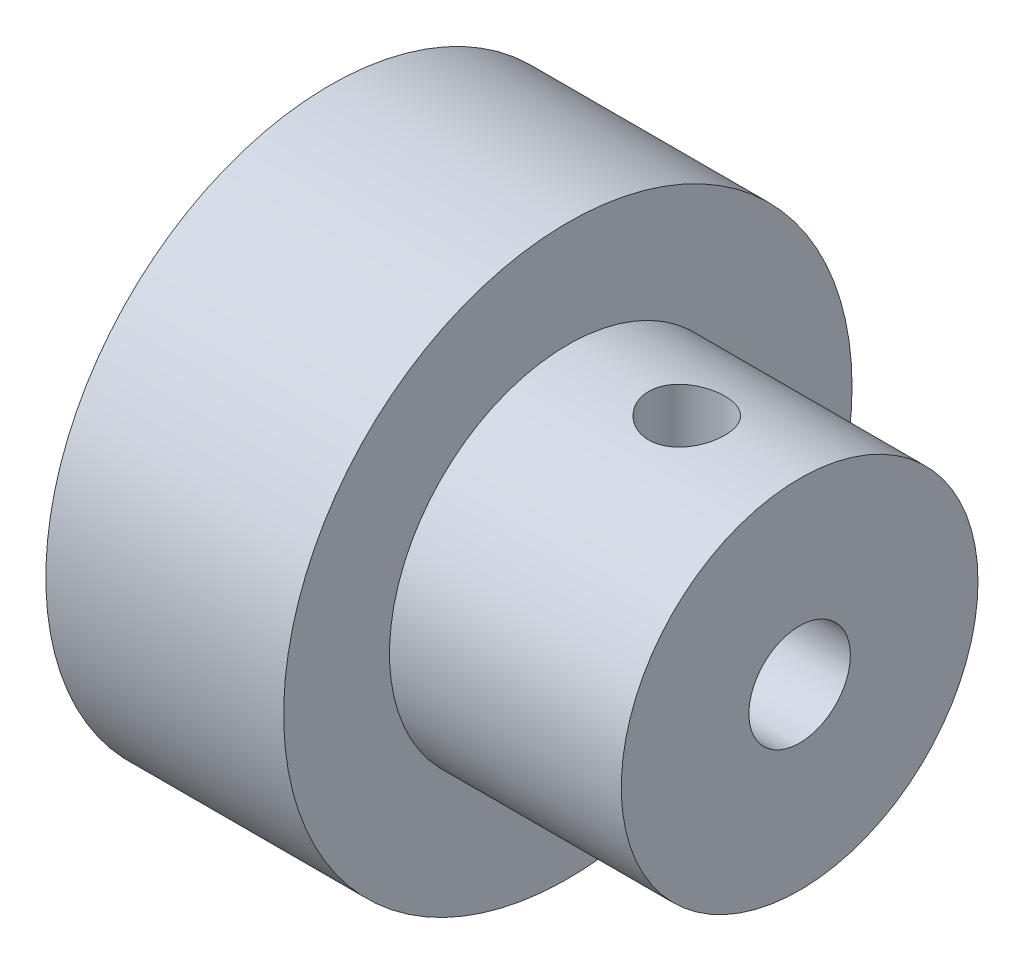
ISO-10303-21;
HEADER;
FILE_DESCRIPTION(('STEP AP214'),'2;1');
FILE_NAME('part.step','',(''),(''),'','','');
FILE_SCHEMA(('AUTOMOTIVE_DESIGN { 1 0 10303 214 1 1 1 1 }'));
ENDSEC;
DATA;
#1=APPLICATION_CONTEXT('core data for automotive mechanical design processes');
#2=APPLICATION_PROTOCOL_DEFINITION('international standard','automotive_design',2000,#1);
#3=PRODUCT_CONTEXT('',#1,'mechanical');
#4=PRODUCT('Part','Part','',(#3));
#5=PRODUCT_RELATED_PRODUCT_CATEGORY('part','',(#4));
#6=PRODUCT_DEFINITION_FORMATION('','',#4);
#7=PRODUCT_DEFINITION_CONTEXT('part definition',#1,'design');
#8=PRODUCT_DEFINITION('design','',#6,#7);
#9=PRODUCT_DEFINITION_SHAPE('','',#8);
#10=(LENGTH_UNIT() NAMED_UNIT(*) SI_UNIT(.MILLI.,.METRE.));
#11=(NAMED_UNIT(*) PLANE_ANGLE_UNIT() SI_UNIT($,.RADIAN.));
#12=(NAMED_UNIT(*) SI_UNIT($,.STERADIAN.) SOLID_ANGLE_UNIT());
#13=UNCERTAINTY_MEASURE_WITH_UNIT(LENGTH_MEASURE(1.E-05),#10,'distance_accuracy_value','');
#14=(GEOMETRIC_REPRESENTATION_CONTEXT(3) GLOBAL_UNCERTAINTY_ASSIGNED_CONTEXT((#13)) GLOBAL_UNIT_ASSIGNED_CONTEXT((#10,
#11,#12)) REPRESENTATION_CONTEXT('',''));
#15=CARTESIAN_POINT('',(0.,0.,0.));
#16=DIRECTION('',(0.,0.,1.));
#17=DIRECTION('',(1.,0.,0.));
#18=AXIS2_PLACEMENT_3D('',#15,#16,#17);
#19=CARTESIAN_POINT('',(-14.6892880689265,0.,0.));
#20=DIRECTION('',(1.,0.,0.));
#21=DIRECTION('',(0.,0.,-1.));
#22=AXIS2_PLACEMENT_3D('',#19,#20,#21);
#23=PLANE('',#22);
#24=CARTESIAN_POINT('',(-14.6892880689265,0.,0.));
#25=DIRECTION('',(1.,0.,0.));
#26=DIRECTION('',(0.,0.,-1.));
#27=AXIS2_PLACEMENT_3D('',#24,#25,#26);
#28=CIRCLE('',#27,8.89);
#29=CARTESIAN_POINT('',(-14.6892880689265,0.,-8.89));
#30=VERTEX_POINT('',#29);
#31=EDGE_CURVE('E122',#30,#30,#28,.T.);
#32=ORIENTED_EDGE('',*,*,#31,.F.);
#33=EDGE_LOOP('',(#32));
#34=FACE_BOUND('',#33,.T.);
#35=CARTESIAN_POINT('',(-14.6892880689265,0.,0.));
#36=DIRECTION('',(1.,0.,0.));
#37=DIRECTION('',(0.,0.,-1.));
#38=AXIS2_PLACEMENT_3D('',#35,#36,#37);
#39=CIRCLE('',#38,1.5875);
#40=CARTESIAN_POINT('',(-14.6892880689265,0.,-1.5875));
#41=VERTEX_POINT('',#40);
#42=EDGE_CURVE('E10',#41,#41,#39,.T.);
#43=ORIENTED_EDGE('',*,*,#42,.T.);
#44=EDGE_LOOP('',(#43));
#45=FACE_BOUND('',#44,.T.);
#46=ADVANCED_FACE('F45',(#34,#45),#23,.F.);
#47=CARTESIAN_POINT('',(0.,0.,0.));
#48=DIRECTION('',(1.,0.,0.));
#49=DIRECTION('',(0.,0.,-1.));
#50=AXIS2_PLACEMENT_3D('',#47,#48,#49);
#51=CYLINDRICAL_SURFACE('',#50,1.5875);
#52=CARTESIAN_POINT('',(-3.52955632665525,-1.05003255157876,1.190625));
#53=CARTESIAN_POINT('',(-3.47399587181116,-1.050045445975,1.19061880120499));
#54=CARTESIAN_POINT('',(-3.41839494567017,-1.05454741000987,1.18668886577821));
#55=CARTESIAN_POINT('',(-3.30942575328898,-1.07148823701036,1.17140301985762));
#56=CARTESIAN_POINT('',(-3.25606464842102,-1.08395075602632,1.16002497361435));
#57=CARTESIAN_POINT('',(-3.15365232330667,-1.11422757784016,1.13096547199778));
#58=CARTESIAN_POINT('',(-3.10455179760005,-1.13196567044321,1.11337314984434));
#59=CARTESIAN_POINT('',(-3.01016962218938,-1.17067373681068,1.0725995764387));
#60=CARTESIAN_POINT('',(-2.96488751182031,-1.19164331985289,1.04941900067592));
#61=CARTESIAN_POINT('',(-2.86906679457896,-1.2396574216291,0.992504284125244));
#62=CARTESIAN_POINT('',(-2.81941365386299,-1.26705442557768,0.957576618231006));
#63=CARTESIAN_POINT('',(-2.72586423782545,-1.321761740015,0.880535424277007));
#64=CARTESIAN_POINT('',(-2.68197661082916,-1.34907186163527,0.83841131436972));
#65=CARTESIAN_POINT('',(-2.59224970284748,-1.40702174808774,0.737878090100433));
#66=CARTESIAN_POINT('',(-2.54784159057137,-1.43720281226121,0.677900035756593));
#67=CARTESIAN_POINT('',(-2.47019994883075,-1.49131980240358,0.548631836139916));
#68=CARTESIAN_POINT('',(-2.43694016553939,-1.51527037067959,0.479364114482458));
#69=CARTESIAN_POINT('',(-2.39194772596979,-1.54808443073509,0.355496037787019));
#70=CARTESIAN_POINT('',(-2.37674788172235,-1.55931958043549,0.302772801943451));
#71=CARTESIAN_POINT('',(-2.35370292208284,-1.57643223525434,0.194907383645006));
#72=CARTESIAN_POINT('',(-2.34585141687053,-1.58231439499439,0.139767346508667));
#73=CARTESIAN_POINT('',(-2.3379615754019,-1.58822529365106,0.0284679172687354));
#74=CARTESIAN_POINT('',(-2.33794354099396,-1.58823882295637,-0.0276937463004187));
#75=CARTESIAN_POINT('',(-2.34577181397461,-1.58237401411808,-0.139157199360015));
#76=CARTESIAN_POINT('',(-2.35361994258859,-1.57649431153499,-0.194458786708892));
#77=CARTESIAN_POINT('',(-2.37630191056096,-1.55965031243376,-0.300743297572916));
#78=CARTESIAN_POINT('',(-2.390887285725,-1.54886705851508,-0.351809262912558));
#79=CARTESIAN_POINT('',(-2.4262403676374,-1.52306558684007,-0.450596385005576));
#80=CARTESIAN_POINT('',(-2.44700942243758,-1.50804644569141,-0.498316809620447));
#81=CARTESIAN_POINT('',(-2.49651420867685,-1.472890802502,-0.594690931730129));
#82=CARTESIAN_POINT('',(-2.52586905334639,-1.45237629107677,-0.642886211616418));
#83=CARTESIAN_POINT('',(-2.59033870418185,-1.40859432596468,-0.733875255122699));
#84=CARTESIAN_POINT('',(-2.62545841877955,-1.38532453106985,-0.776664360293093));
#85=CARTESIAN_POINT('',(-2.70820235978188,-1.33265676661185,-0.864458871498921));
#86=CARTESIAN_POINT('',(-2.75692738711371,-1.30295376843929,-0.908244413225473));
#87=CARTESIAN_POINT('',(-2.86108752740517,-1.24401229387742,-0.987431949727556));
#88=CARTESIAN_POINT('',(-2.91652581815327,-1.21477404494797,-1.0228299505536));
#89=CARTESIAN_POINT('',(-3.02233568616272,-1.16537919386833,-1.07849357589208));
#90=CARTESIAN_POINT('',(-3.07155229386264,-1.14456844833299,-1.10036663076556));
#91=CARTESIAN_POINT('',(-3.17400814378189,-1.10757288373056,-1.13759771455097));
#92=CARTESIAN_POINT('',(-3.22723796990948,-1.09137763785656,-1.15297046685305));
#93=CARTESIAN_POINT('',(-3.32610783845392,-1.06870540179809,-1.17397518372094));
#94=CARTESIAN_POINT('',(-3.37116119808551,-1.06093847023265,-1.18093386412912));
#95=CARTESIAN_POINT('',(-3.46236972793073,-1.05120748322927,-1.18960709991958));
#96=CARTESIAN_POINT('',(-3.50852341207812,-1.04923600365031,-1.19132836468154));
#97=CARTESIAN_POINT('',(-3.60058027634364,-1.05142402102457,-1.18939683154219));
#98=CARTESIAN_POINT('',(-3.64648335801668,-1.05558577464436,-1.1857420555772));
#99=CARTESIAN_POINT('',(-3.73678552265678,-1.06934967402693,-1.17334131022126));
#100=CARTESIAN_POINT('',(-3.78118190127656,-1.0789611050858,-1.16458665082263));
#101=CARTESIAN_POINT('',(-3.88383714982548,-1.10670783140942,-1.13834830402645));
#102=CARTESIAN_POINT('',(-3.94106486507531,-1.12668703809744,-1.11882388129336));
#103=CARTESIAN_POINT('',(-4.05050053466959,-1.1710817723223,-1.07226796784258));
#104=CARTESIAN_POINT('',(-4.10269900600796,-1.19550543916301,-1.04522265503785));
#105=CARTESIAN_POINT('',(-4.20372710179345,-1.24704699135672,-0.983216332051275));
#106=CARTESIAN_POINT('',(-4.25237117215349,-1.27422976552798,-0.948008248603961));
#107=CARTESIAN_POINT('',(-4.34394549064199,-1.32832083103686,-0.870605343134578));
#108=CARTESIAN_POINT('',(-4.38687294449647,-1.3552289822489,-0.828407126793555));
#109=CARTESIAN_POINT('',(-4.47513243876106,-1.41255926707429,-0.727261145352264));
#110=CARTESIAN_POINT('',(-4.51894604749847,-1.44246738243752,-0.666667665064069));
#111=CARTESIAN_POINT('',(-4.59526153383188,-1.49584651911049,-0.536219092541945));
#112=CARTESIAN_POINT('',(-4.62778789366665,-1.519331448665,-0.46638450504254));
#113=CARTESIAN_POINT('',(-4.6713164823662,-1.55114153831888,-0.341912306313174));
#114=CARTESIAN_POINT('',(-4.68585703131764,-1.56190535686026,-0.289123483003683));
#115=CARTESIAN_POINT('',(-4.70758355872435,-1.57805648311366,-0.181264294065456));
#116=CARTESIAN_POINT('',(-4.71477611263438,-1.58344859766149,-0.126196014246044));
#117=CARTESIAN_POINT('',(-4.72138496195483,-1.58840143581668,-0.0151984122151932));
#118=CARTESIAN_POINT('',(-4.72078300292542,-1.58794847048757,0.040732624740999));
#119=CARTESIAN_POINT('',(-4.7117985398099,-1.58121987574774,0.151613402505125));
#120=CARTESIAN_POINT('',(-4.70341396297494,-1.57494269517078,0.206562877919334));
#121=CARTESIAN_POINT('',(-4.67971998694751,-1.55736449484373,0.312358036108632));
#122=CARTESIAN_POINT('',(-4.66461868273127,-1.54621460816847,0.363276543980955));
#123=CARTESIAN_POINT('',(-4.62827454957022,-1.51973534456514,0.461693691083551));
#124=CARTESIAN_POINT('',(-4.60703040691447,-1.50440507365769,0.50919159606487));
#125=CARTESIAN_POINT('',(-4.55644821368846,-1.46857753504696,0.605272235896156));
#126=CARTESIAN_POINT('',(-4.52646589988858,-1.44769167461642,0.653368356641274));
#127=CARTESIAN_POINT('',(-4.46073108946535,-1.403234954476,0.744073006806094));
#128=CARTESIAN_POINT('',(-4.42497328955946,-1.37966163294053,0.786676427329301));
#129=CARTESIAN_POINT('',(-4.34076456694763,-1.32640667727172,0.874017021494155));
#130=CARTESIAN_POINT('',(-4.29120199709983,-1.29643919738103,0.917509051614588));
#131=CARTESIAN_POINT('',(-4.18529854458473,-1.2371870295527,0.995959824095465));
#132=CARTESIAN_POINT('',(-4.12895518973873,-1.20790259531751,1.03091544004403));
#133=CARTESIAN_POINT('',(-4.0225677464992,-1.15926871150369,1.0850242722053));
#134=CARTESIAN_POINT('',(-3.97379043413193,-1.13913939849811,1.10595986530786));
#135=CARTESIAN_POINT('',(-3.87239051441715,-1.10357098191916,1.14145534685201));
#136=CARTESIAN_POINT('',(-3.81977855895137,-1.08811945745383,1.15603216594685));
#137=CARTESIAN_POINT('',(-3.72736817735019,-1.06785111060464,1.17472664594127));
#138=CARTESIAN_POINT('',(-3.68833246381845,-1.06124478398383,1.18065747665075));
#139=CARTESIAN_POINT('',(-3.60938984980979,-1.05233228217761,1.18860759763756));
#140=CARTESIAN_POINT('',(-3.56948353840617,-1.05002328532471,1.19062945461798));
#141=CARTESIAN_POINT('',(-3.52955632665525,-1.05003255157876,1.190625));
#142=B_SPLINE_CURVE_WITH_KNOTS('',3,(#52,#53,#54,#55,#56,#57,#58,#59,#60,#61,#62,#63,#64,#65,
#66,#67,#68,#69,#70,#71,#72,#73,#74,#75,#76,#77,#78,#79,#80,#81,#82,#83,#84,#85,#86,#87,#88,#89,
#90,#91,#92,#93,#94,#95,#96,#97,#98,#99,#100,#101,#102,#103,#104,#105,#106,#107,#108,#109,#110,
#111,#112,#113,#114,#115,#116,#117,#118,#119,#120,#121,#122,#123,#124,#125,#126,#127,#128,#129,
#130,#131,#132,#133,#134,#135,#136,#137,#138,#139,#140,#141),.UNSPECIFIED.,.T.,.F.,(4,2,2,2,2,2,
2,2,2,2,2,2,2,2,2,2,2,2,2,2,2,2,2,2,2,2,2,2,2,2,2,2,2,2,2,2,2,2,2,2,2,2,2,2,4),(0.,
0.166474597743314,0.333446217300251,0.498114149835984,0.662762187833673,0.861895093986152,
1.0613233713153,1.30147098182183,1.54104901534439,1.70837006939059,1.87554549222377,
2.04315417765196,2.21080167790273,2.37270731241696,2.53464826848756,2.71412370017785,
2.89375274442082,3.10871804281232,3.32378549783047,3.49646406272525,3.66874938249073,
3.80688854402059,3.9448506680219,4.08286356658931,4.22111232464965,4.41110709885653,
4.60145338469826,4.79856172215235,4.99576605498253,5.23599171487223,5.47569301565586,
5.64239486354326,5.80894740496725,5.97589007623953,6.14287722220568,6.30501670074205,
6.46719088019845,6.64773604163628,6.82844793934811,7.0449089208391,7.26144906140521,
7.43123259464913,7.6005612670708,7.72027294583552,7.83990599300725),.UNSPECIFIED.);
#143=CARTESIAN_POINT('',(-3.52955632665525,-1.05003255157876,1.190625));
#144=VERTEX_POINT('',#143);
#145=EDGE_CURVE('E95',#144,#144,#142,.T.);
#146=ORIENTED_EDGE('',*,*,#145,.F.);
#147=EDGE_LOOP('',(#146));
#148=FACE_BOUND('',#147,.T.);
#149=CARTESIAN_POINT('',(-3.52955632665525,1.05003255157876,1.190625));
#150=CARTESIAN_POINT('',(-3.58511678149935,1.050045445975,1.19061880120499));
#151=CARTESIAN_POINT('',(-3.64071770764034,1.05454741000987,1.18668886577821));
#152=CARTESIAN_POINT('',(-3.74968690002153,1.07148823701036,1.17140301985762));
#153=CARTESIAN_POINT('',(-3.80304800488949,1.08395075602632,1.16002497361435));
#154=CARTESIAN_POINT('',(-3.90546033000384,1.11422757784016,1.13096547199778));
#155=CARTESIAN_POINT('',(-3.95456085571046,1.13196567044321,1.11337314984434));
#156=CARTESIAN_POINT('',(-4.04894303112113,1.17067373681068,1.0725995764387));
#157=CARTESIAN_POINT('',(-4.0942251414902,1.19164331985289,1.04941900067592));
#158=CARTESIAN_POINT('',(-4.19004585873155,1.2396574216291,0.992504284125244));
#159=CARTESIAN_POINT('',(-4.23969899944752,1.26705442557768,0.957576618231007));
#160=CARTESIAN_POINT('',(-4.33324841548505,1.321761740015,0.880535424277007));
#161=CARTESIAN_POINT('',(-4.37713604248134,1.34907186163527,0.83841131436972));
#162=CARTESIAN_POINT('',(-4.46686295046303,1.40702174808774,0.737878090100434));
#163=CARTESIAN_POINT('',(-4.51127106273914,1.43720281226121,0.677900035756593));
#164=CARTESIAN_POINT('',(-4.58891270447975,1.49131980240358,0.548631836139916));
#165=CARTESIAN_POINT('',(-4.62217248777112,1.51527037067959,0.479364114482458));
#166=CARTESIAN_POINT('',(-4.66716492734071,1.54808443073509,0.355496037787019));
#167=CARTESIAN_POINT('',(-4.68236477158816,1.55931958043549,0.302772801943451));
#168=CARTESIAN_POINT('',(-4.70540973122767,1.57643223525434,0.194907383645006));
#169=CARTESIAN_POINT('',(-4.71326123643998,1.58231439499439,0.139767346508666));
#170=CARTESIAN_POINT('',(-4.72115107790861,1.58822529365106,0.0284679172687352));
#171=CARTESIAN_POINT('',(-4.72116911231655,1.58823882295637,-0.0276937463004189));
#172=CARTESIAN_POINT('',(-4.7133408393359,1.58237401411808,-0.139157199360016));
#173=CARTESIAN_POINT('',(-4.70549271072191,1.57649431153499,-0.194458786708892));
#174=CARTESIAN_POINT('',(-4.68281074274955,1.55965031243376,-0.300743297572916));
#175=CARTESIAN_POINT('',(-4.66822536758551,1.54886705851508,-0.351809262912558));
#176=CARTESIAN_POINT('',(-4.63287228567311,1.52306558684007,-0.450596385005576));
#177=CARTESIAN_POINT('',(-4.61210323087293,1.50804644569141,-0.498316809620447));
#178=CARTESIAN_POINT('',(-4.56259844463366,1.472890802502,-0.594690931730128));
#179=CARTESIAN_POINT('',(-4.53324359996412,1.45237629107677,-0.642886211616417));
#180=CARTESIAN_POINT('',(-4.46877394912866,1.40859432596468,-0.733875255122699));
#181=CARTESIAN_POINT('',(-4.43365423453096,1.38532453106985,-0.776664360293093));
#182=CARTESIAN_POINT('',(-4.35091029352863,1.33265676661185,-0.86445887149892));
#183=CARTESIAN_POINT('',(-4.3021852661968,1.30295376843929,-0.908244413225473));
#184=CARTESIAN_POINT('',(-4.19802512590534,1.24401229387742,-0.987431949727557));
#185=CARTESIAN_POINT('',(-4.14258683515724,1.21477404494797,-1.0228299505536));
#186=CARTESIAN_POINT('',(-4.03677696714779,1.16537919386833,-1.07849357589208));
#187=CARTESIAN_POINT('',(-3.98756035944787,1.14456844833299,-1.10036663076556));
#188=CARTESIAN_POINT('',(-3.88510450952862,1.10757288373056,-1.13759771455097));
#189=CARTESIAN_POINT('',(-3.83187468340103,1.09137763785656,-1.15297046685305));
#190=CARTESIAN_POINT('',(-3.73300481485659,1.06870540179809,-1.17397518372094));
#191=CARTESIAN_POINT('',(-3.687951455225,1.06093847023265,-1.18093386412912));
#192=CARTESIAN_POINT('',(-3.59674292537978,1.05120748322927,-1.18960709991958));
#193=CARTESIAN_POINT('',(-3.55058924123239,1.04923600365031,-1.19132836468154));
#194=CARTESIAN_POINT('',(-3.45853237696687,1.05142402102457,-1.18939683154219));
#195=CARTESIAN_POINT('',(-3.41262929529383,1.05558577464436,-1.1857420555772));
#196=CARTESIAN_POINT('',(-3.32232713065373,1.06934967402693,-1.17334131022126));
#197=CARTESIAN_POINT('',(-3.27793075203395,1.0789611050858,-1.16458665082263));
#198=CARTESIAN_POINT('',(-3.17527550348503,1.10670783140942,-1.13834830402645));
#199=CARTESIAN_POINT('',(-3.1180477882352,1.12668703809744,-1.11882388129336));
#200=CARTESIAN_POINT('',(-3.00861211864092,1.1710817723223,-1.07226796784258));
#201=CARTESIAN_POINT('',(-2.95641364730255,1.19550543916301,-1.04522265503785));
#202=CARTESIAN_POINT('',(-2.85538555151706,1.24704699135672,-0.983216332051275));
#203=CARTESIAN_POINT('',(-2.80674148115702,1.27422976552798,-0.948008248603961));
#204=CARTESIAN_POINT('',(-2.71516716266852,1.32832083103686,-0.870605343134578));
#205=CARTESIAN_POINT('',(-2.67223970881404,1.3552289822489,-0.828407126793555));
#206=CARTESIAN_POINT('',(-2.58398021454945,1.41255926707429,-0.727261145352264));
#207=CARTESIAN_POINT('',(-2.54016660581204,1.44246738243751,-0.66666766506407));
#208=CARTESIAN_POINT('',(-2.46385111947863,1.49584651911049,-0.536219092541946));
#209=CARTESIAN_POINT('',(-2.43132475964385,1.519331448665,-0.466384505042541));
#210=CARTESIAN_POINT('',(-2.3877961709443,1.55114153831888,-0.341912306313175));
#211=CARTESIAN_POINT('',(-2.37325562199287,1.56190535686026,-0.289123483003684));
#212=CARTESIAN_POINT('',(-2.35152909458616,1.57805648311366,-0.181264294065457));
#213=CARTESIAN_POINT('',(-2.34433654067613,1.58344859766149,-0.126196014246045));
#214=CARTESIAN_POINT('',(-2.33772769135568,1.58840143581668,-0.0151984122151944));
#215=CARTESIAN_POINT('',(-2.33832965038508,1.58794847048757,0.0407326247409978));
#216=CARTESIAN_POINT('',(-2.34731411350061,1.58121987574774,0.151613402505124));
#217=CARTESIAN_POINT('',(-2.35569869033556,1.57494269517078,0.206562877919333));
#218=CARTESIAN_POINT('',(-2.379392666363,1.55736449484374,0.312358036108631));
#219=CARTESIAN_POINT('',(-2.39449397057923,1.54621460816847,0.363276543980954));
#220=CARTESIAN_POINT('',(-2.43083810374029,1.51973534456514,0.46169369108355));
#221=CARTESIAN_POINT('',(-2.45208224639604,1.50440507365769,0.509191596064869));
#222=CARTESIAN_POINT('',(-2.50266443962205,1.46857753504696,0.605272235896155));
#223=CARTESIAN_POINT('',(-2.53264675342192,1.44769167461642,0.653368356641273));
#224=CARTESIAN_POINT('',(-2.59838156384516,1.403234954476,0.744073006806093));
#225=CARTESIAN_POINT('',(-2.63413936375105,1.37966163294053,0.7866764273293));
#226=CARTESIAN_POINT('',(-2.71834808636288,1.32640667727172,0.874017021494154));
#227=CARTESIAN_POINT('',(-2.76791065621068,1.29643919738103,0.917509051614587));
#228=CARTESIAN_POINT('',(-2.87381410872578,1.2371870295527,0.995959824095464));
#229=CARTESIAN_POINT('',(-2.93015746357177,1.20790259531751,1.03091544004403));
#230=CARTESIAN_POINT('',(-3.03654490681131,1.15926871150369,1.0850242722053));
#231=CARTESIAN_POINT('',(-3.08532221917858,1.13913939849812,1.10595986530786));
#232=CARTESIAN_POINT('',(-3.18672213889336,1.10357098191916,1.14145534685201));
#233=CARTESIAN_POINT('',(-3.23933409435914,1.08811945745383,1.15603216594685));
#234=CARTESIAN_POINT('',(-3.33174447596032,1.06785111060464,1.17472664594127));
#235=CARTESIAN_POINT('',(-3.37078018949206,1.06124478398383,1.18065747665075));
#236=CARTESIAN_POINT('',(-3.44972280350072,1.05233228217761,1.18860759763756));
#237=CARTESIAN_POINT('',(-3.48962911490434,1.05002328532471,1.19062945461798));
#238=CARTESIAN_POINT('',(-3.52955632665525,1.05003255157876,1.190625));
#239=B_SPLINE_CURVE_WITH_KNOTS('',3,(#149,#150,#151,#152,#153,#154,#155,#156,#157,#158,#159,
#160,#161,#162,#163,#164,#165,#166,#167,#168,#169,#170,#171,#172,#173,#174,#175,#176,#177,#178,
#179,#180,#181,#182,#183,#184,#185,#186,#187,#188,#189,#190,#191,#192,#193,#194,#195,#196,#197,
#198,#199,#200,#201,#202,#203,#204,#205,#206,#207,#208,#209,#210,#211,#212,#213,#214,#215,#216,
#217,#218,#219,#220,#221,#222,#223,#224,#225,#226,#227,#228,#229,#230,#231,#232,#233,#234,#235,
#236,#237,#238),.UNSPECIFIED.,.T.,.F.,(4,2,2,2,2,2,2,2,2,2,2,2,2,2,2,2,2,2,2,2,2,2,2,2,2,2,2,2,
2,2,2,2,2,2,2,2,2,2,2,2,2,2,2,2,4),(0.,0.166474597743314,0.333446217300251,0.498114149835984,
0.662762187833672,0.861895093986151,1.0613233713153,1.30147098182183,1.5410490153444,
1.70837006939059,1.87554549222377,2.04315417765196,2.21080167790273,2.37270731241696,
2.53464826848756,2.71412370017785,2.89375274442082,3.10871804281232,3.32378549783047,
3.49646406272525,3.66874938249073,3.80688854402059,3.9448506680219,4.08286356658931,
4.22111232464965,4.41110709885653,4.60145338469826,4.79856172215235,4.99576605498252,
5.23599171487223,5.47569301565586,5.64239486354326,5.80894740496724,5.97589007623953,
6.14287722220568,6.30501670074205,6.46719088019845,6.64773604163628,6.82844793934811,
7.0449089208391,7.26144906140521,7.43123259464912,7.60056126707079,7.72027294583552,
7.83990599300725),.UNSPECIFIED.);
#240=CARTESIAN_POINT('',(-3.52955632665525,1.05003255157876,1.190625));
#241=VERTEX_POINT('',#240);
#242=EDGE_CURVE('E89',#241,#241,#239,.T.);
#243=ORIENTED_EDGE('',*,*,#242,.F.);
#244=EDGE_LOOP('',(#243));
#245=FACE_BOUND('',#244,.T.);
#246=CARTESIAN_POINT('',(0.,0.,0.));
#247=DIRECTION('',(1.,0.,0.));
#248=DIRECTION('',(0.,0.,-1.));
#249=AXIS2_PLACEMENT_3D('',#246,#247,#248);
#250=CIRCLE('',#249,1.5875);
#251=CARTESIAN_POINT('',(0.,0.,-1.5875));
#252=VERTEX_POINT('',#251);
#253=EDGE_CURVE('E58',#252,#252,#250,.T.);
#254=ORIENTED_EDGE('',*,*,#253,.T.);
#255=EDGE_LOOP('',(#254));
#256=FACE_BOUND('',#255,.T.);
#257=ORIENTED_EDGE('',*,*,#42,.F.);
#258=EDGE_LOOP('',(#257));
#259=FACE_BOUND('',#258,.T.);
#260=ADVANCED_FACE('F100',(#148,#245,#256,#259),#51,.F.);
#261=CARTESIAN_POINT('',(0.,0.,0.));
#262=DIRECTION('',(1.,0.,0.));
#263=DIRECTION('',(0.,0.,-1.));
#264=AXIS2_PLACEMENT_3D('',#261,#262,#263);
#265=PLANE('',#264);
#266=CARTESIAN_POINT('',(0.,0.,0.));
#267=DIRECTION('',(1.,0.,0.));
#268=DIRECTION('',(0.,0.,-1.));
#269=AXIS2_PLACEMENT_3D('',#266,#267,#268);
#270=CIRCLE('',#269,5.5794077);
#271=CARTESIAN_POINT('',(0.,0.,-5.5794077));
#272=VERTEX_POINT('',#271);
#273=EDGE_CURVE('E64',#272,#272,#270,.T.);
#274=ORIENTED_EDGE('',*,*,#273,.T.);
#275=EDGE_LOOP('',(#274));
#276=FACE_BOUND('',#275,.T.);
#277=ORIENTED_EDGE('',*,*,#253,.F.);
#278=EDGE_LOOP('',(#277));
#279=FACE_BOUND('',#278,.T.);
#280=ADVANCED_FACE('F103',(#276,#279),#265,.T.);
#281=CARTESIAN_POINT('',(0.,0.,0.));
#282=DIRECTION('',(1.,0.,0.));
#283=DIRECTION('',(0.,0.,-1.));
#284=AXIS2_PLACEMENT_3D('',#281,#282,#283);
#285=CYLINDRICAL_SURFACE('',#284,5.5794077);
#286=CARTESIAN_POINT('',(-3.52955632665525,-5.45089005504553,1.190625));
#287=CARTESIAN_POINT('',(-3.59561209279618,-5.45089138833932,1.19062267534356));
#288=CARTESIAN_POINT('',(-3.66169618311161,-5.45210385725553,1.18510915928376));
#289=CARTESIAN_POINT('',(-3.79198794136711,-5.45681434041541,1.16322321170161));
#290=CARTESIAN_POINT('',(-3.85619417306021,-5.46031405860686,1.14684268437002));
#291=CARTESIAN_POINT('',(-3.98082657301057,-5.46918504111944,1.10375958343174));
#292=CARTESIAN_POINT('',(-4.04125669509624,-5.47455430781794,1.0770680238998));
#293=CARTESIAN_POINT('',(-4.15678165965703,-5.48655701007113,1.01415167020627));
#294=CARTESIAN_POINT('',(-4.21187666664193,-5.49319040662727,0.977927170123733));
#295=CARTESIAN_POINT('',(-4.31605506173414,-5.50709315208868,0.896352152027764));
#296=CARTESIAN_POINT('',(-4.36504014329567,-5.51437030161851,0.850877396233426));
#297=CARTESIAN_POINT('',(-4.45474801052462,-5.52867220431466,0.752360996666357));
#298=CARTESIAN_POINT('',(-4.49547017294703,-5.53569693840926,0.699318782618492));
#299=CARTESIAN_POINT('',(-4.56788295953394,-5.5487872290787,0.586516389022669));
#300=CARTESIAN_POINT('',(-4.59947936050573,-5.55484250976634,0.526694428523841));
#301=CARTESIAN_POINT('',(-4.6521345925998,-5.56522365551552,0.402439368715937));
#302=CARTESIAN_POINT('',(-4.6731945483497,-5.56954970513994,0.338006762372461));
#303=CARTESIAN_POINT('',(-4.70387080722468,-5.57592984023195,0.207381038407033));
#304=CARTESIAN_POINT('',(-4.7136533838396,-5.57801690443856,0.141228606450573));
#305=CARTESIAN_POINT('',(-4.72201673800772,-5.5797980684991,0.00819080813863732));
#306=CARTESIAN_POINT('',(-4.72059873784058,-5.57949242946038,-0.0586944774476233));
#307=CARTESIAN_POINT('',(-4.70672569494581,-5.57654793107628,-0.190154197764911));
#308=CARTESIAN_POINT('',(-4.69444983842787,-5.57394695306744,-0.254748515086689));
#309=CARTESIAN_POINT('',(-4.65949469919189,-5.56674705344288,-0.380938660586805));
#310=CARTESIAN_POINT('',(-4.63681496125414,-5.56214804440418,-0.442534357430659));
#311=CARTESIAN_POINT('',(-4.58153516864336,-5.5514074648972,-0.561480234010109));
#312=CARTESIAN_POINT('',(-4.54886652660487,-5.54525528237453,-0.618797540472191));
#313=CARTESIAN_POINT('',(-4.47458729460726,-5.53208400982687,-0.727202213947748));
#314=CARTESIAN_POINT('',(-4.43297554150154,-5.52506480708723,-0.778288769229789));
#315=CARTESIAN_POINT('',(-4.34101353963673,-5.51076819828843,-0.873846839743643));
#316=CARTESIAN_POINT('',(-4.29050646044542,-5.50348843195295,-0.918167200932947));
#317=CARTESIAN_POINT('',(-4.18270186096069,-5.48962196182033,-0.997735981373928));
#318=CARTESIAN_POINT('',(-4.12540417410871,-5.48303527503038,-1.0329841780382));
#319=CARTESIAN_POINT('',(-4.00540848939152,-5.4712949411322,-1.09347077772886));
#320=CARTESIAN_POINT('',(-3.94269629056251,-5.46614522216073,-1.11868182156021));
#321=CARTESIAN_POINT('',(-3.81378987557217,-5.45791718130801,-1.15816286936266));
#322=CARTESIAN_POINT('',(-3.7475961840842,-5.45483854826562,-1.17243451691983));
#323=CARTESIAN_POINT('',(-3.61498366026852,-5.45116439494392,-1.18939971337218));
#324=CARTESIAN_POINT('',(-3.54859418840266,-5.45052179324764,-1.19231282188109));
#325=CARTESIAN_POINT('',(-3.4162781637176,-5.45166563949854,-1.18707162124703));
#326=CARTESIAN_POINT('',(-3.35035158102476,-5.45345192921589,-1.17891803304271));
#327=CARTESIAN_POINT('',(-3.2215894406079,-5.45920793650147,-1.15196503679253));
#328=CARTESIAN_POINT('',(-3.15872759150608,-5.46315305574627,-1.13328549441822));
#329=CARTESIAN_POINT('',(-3.03702584436527,-5.47276019883331,-1.08594014177795));
#330=CARTESIAN_POINT('',(-2.97818631648523,-5.47842238043033,-1.05727341390512));
#331=CARTESIAN_POINT('',(-2.8652461929484,-5.49092978726987,-0.990279826636815));
#332=CARTESIAN_POINT('',(-2.81122802456078,-5.49779118762193,-0.951817089302762));
#333=CARTESIAN_POINT('',(-2.71033234623808,-5.51188076891162,-0.866502063450775));
#334=CARTESIAN_POINT('',(-2.66345567951088,-5.51910899302658,-0.819648785667679));
#335=CARTESIAN_POINT('',(-2.57732724839981,-5.53327228228267,-0.717891426472553));
#336=CARTESIAN_POINT('',(-2.53822481446614,-5.54019991267988,-0.662859742370203));
#337=CARTESIAN_POINT('',(-2.46982014985808,-5.55284692915589,-0.546881096721388));
#338=CARTESIAN_POINT('',(-2.44051747382852,-5.55856637013714,-0.485934404148056));
#339=CARTESIAN_POINT('',(-2.3927549449665,-5.56812111241917,-0.360225745125689));
#340=CARTESIAN_POINT('',(-2.37422836113245,-5.571967984862,-0.295490052057311));
#341=CARTESIAN_POINT('',(-2.34833456718188,-5.57739406806527,-0.163734234652268));
#342=CARTESIAN_POINT('',(-2.34096581695332,-5.57897359178552,-0.0967144268972208));
#343=CARTESIAN_POINT('',(-2.33766330761849,-5.57967826973869,0.0362870395961198));
#344=CARTESIAN_POINT('',(-2.34150614699852,-5.57885137496443,0.102262996989614));
#345=CARTESIAN_POINT('',(-2.36001991770399,-5.57493829902964,0.232605693277145));
#346=CARTESIAN_POINT('',(-2.3746906723207,-5.57185215473947,0.296972458415054));
#347=CARTESIAN_POINT('',(-2.41433897900585,-5.563770251964,0.422106646187407));
#348=CARTESIAN_POINT('',(-2.43928625476484,-5.5587801061365,0.482884047258034));
#349=CARTESIAN_POINT('',(-2.49874936140749,-5.54742434759194,0.599420792065673));
#350=CARTESIAN_POINT('',(-2.53326607213077,-5.54105860841099,0.655179673761754));
#351=CARTESIAN_POINT('',(-2.6116240847634,-5.52750304112824,0.761190758856712));
#352=CARTESIAN_POINT('',(-2.65562330350322,-5.52030034944482,0.811324604817926));
#353=CARTESIAN_POINT('',(-2.75137703990202,-5.50595398535591,0.903573782316653));
#354=CARTESIAN_POINT('',(-2.80313341335056,-5.4988103275061,0.945687189588357));
#355=CARTESIAN_POINT('',(-2.91371546816184,-5.48529096598141,1.02120890386656));
#356=CARTESIAN_POINT('',(-2.97262194715261,-5.47892606298749,1.05450094029931));
#357=CARTESIAN_POINT('',(-3.09531563024828,-5.46781946288989,1.11066037989864));
#358=CARTESIAN_POINT('',(-3.15909855977186,-5.46307636366745,1.13353679351999));
#359=CARTESIAN_POINT('',(-3.27406830375355,-5.45664800385129,1.16402744742716));
#360=CARTESIAN_POINT('',(-3.32462157813125,-5.45450282093838,1.17398278474688));
#361=CARTESIAN_POINT('',(-3.42662963786842,-5.45162335825033,1.18728232064453));
#362=CARTESIAN_POINT('',(-3.47808438328203,-5.45088901611696,1.19062681141771));
#363=CARTESIAN_POINT('',(-3.52955632665525,-5.45089005504553,1.190625));
#364=B_SPLINE_CURVE_WITH_KNOTS('',3,(#286,#287,#288,#289,#290,#291,#292,#293,#294,#295,#296,
#297,#298,#299,#300,#301,#302,#303,#304,#305,#306,#307,#308,#309,#310,#311,#312,#313,#314,#315,
#316,#317,#318,#319,#320,#321,#322,#323,#324,#325,#326,#327,#328,#329,#330,#331,#332,#333,#334,
#335,#336,#337,#338,#339,#340,#341,#342,#343,#344,#345,#346,#347,#348,#349,#350,#351,#352,#353,
#354,#355,#356,#357,#358,#359,#360,#361,#362,#363),.UNSPECIFIED.,.T.,.F.,(4,2,2,2,2,2,2,2,2,2,2,
2,2,2,2,2,2,2,2,2,2,2,2,2,2,2,2,2,2,2,2,2,2,2,2,2,2,2,4),(0.,0.197978711257119,
0.396105080452636,0.594020396929303,0.79192960868653,0.992696908277839,1.19347934546626,
1.39626625417247,1.59903151341025,1.7987673475978,1.99848138561542,2.19495980429494,
2.39144682066768,2.58931449393153,2.78720791757921,2.98902302760149,3.19084308872668,
3.39320956361743,3.59554562805961,3.79395057701014,3.99234260151382,4.1885197863017,
4.38471500029585,4.58379581036412,4.7829001080169,4.98552176719756,5.1881342168784,
5.38947825015528,5.59079448944857,5.78812687969002,5.98545604958977,6.18220796693163,
6.37897798017772,6.57932049256685,6.77971101079988,6.98262440554539,7.18536192677508,
7.33963762513244,7.4939065044486),.UNSPECIFIED.);
#365=CARTESIAN_POINT('',(-3.52955632665525,-5.45089005504553,1.190625));
#366=VERTEX_POINT('',#365);
#367=EDGE_CURVE('E48',#366,#366,#364,.T.);
#368=ORIENTED_EDGE('',*,*,#367,.F.);
#369=EDGE_LOOP('',(#368));
#370=FACE_BOUND('',#369,.T.);
#371=CARTESIAN_POINT('',(-3.52955632665525,5.45089005504553,1.190625));
#372=CARTESIAN_POINT('',(-3.46350056051433,5.45089138833932,1.19062267534356));
#373=CARTESIAN_POINT('',(-3.3974164701989,5.45210385725553,1.18510915928376));
#374=CARTESIAN_POINT('',(-3.2671247119434,5.45681434041541,1.16322321170161));
#375=CARTESIAN_POINT('',(-3.2029184802503,5.46031405860686,1.14684268437002));
#376=CARTESIAN_POINT('',(-3.07828608029993,5.46918504111944,1.10375958343174));
#377=CARTESIAN_POINT('',(-3.01785595821426,5.47455430781794,1.0770680238998));
#378=CARTESIAN_POINT('',(-2.90233099365348,5.48655701007113,1.01415167020627));
#379=CARTESIAN_POINT('',(-2.84723598666858,5.49319040662727,0.977927170123733));
#380=CARTESIAN_POINT('',(-2.74305759157636,5.50709315208868,0.896352152027765));
#381=CARTESIAN_POINT('',(-2.69407251001484,5.51437030161851,0.850877396233427));
#382=CARTESIAN_POINT('',(-2.60436464278589,5.52867220431466,0.752360996666357));
#383=CARTESIAN_POINT('',(-2.56364248036348,5.53569693840926,0.699318782618492));
#384=CARTESIAN_POINT('',(-2.49122969377657,5.5487872290787,0.586516389022669));
#385=CARTESIAN_POINT('',(-2.45963329280478,5.55484250976634,0.526694428523841));
#386=CARTESIAN_POINT('',(-2.40697806071071,5.56522365551553,0.402439368715937));
#387=CARTESIAN_POINT('',(-2.38591810496081,5.56954970513994,0.338006762372461));
#388=CARTESIAN_POINT('',(-2.35524184608583,5.57592984023195,0.207381038407033));
#389=CARTESIAN_POINT('',(-2.34545926947091,5.57801690443856,0.141228606450573));
#390=CARTESIAN_POINT('',(-2.33709591530279,5.5797980684991,0.00819080813863742));
#391=CARTESIAN_POINT('',(-2.33851391546993,5.57949242946038,-0.0586944774476232));
#392=CARTESIAN_POINT('',(-2.3523869583647,5.57654793107628,-0.190154197764911));
#393=CARTESIAN_POINT('',(-2.36466281488264,5.57394695306744,-0.254748515086688));
#394=CARTESIAN_POINT('',(-2.39961795411862,5.56674705344288,-0.380938660586805));
#395=CARTESIAN_POINT('',(-2.42229769205637,5.56214804440418,-0.442534357430659));
#396=CARTESIAN_POINT('',(-2.47757748466715,5.5514074648972,-0.561480234010109));
#397=CARTESIAN_POINT('',(-2.51024612670564,5.54525528237453,-0.61879754047219));
#398=CARTESIAN_POINT('',(-2.58452535870325,5.53208400982687,-0.727202213947747));
#399=CARTESIAN_POINT('',(-2.62613711180897,5.52506480708723,-0.778288769229788));
#400=CARTESIAN_POINT('',(-2.71809911367378,5.51076819828843,-0.873846839743643));
#401=CARTESIAN_POINT('',(-2.76860619286509,5.50348843195295,-0.918167200932946));
#402=CARTESIAN_POINT('',(-2.87641079234982,5.48962196182033,-0.997735981373928));
#403=CARTESIAN_POINT('',(-2.9337084792018,5.48303527503038,-1.0329841780382));
#404=CARTESIAN_POINT('',(-3.05370416391899,5.4712949411322,-1.09347077772886));
#405=CARTESIAN_POINT('',(-3.116416362748,5.46614522216073,-1.11868182156021));
#406=CARTESIAN_POINT('',(-3.24532277773833,5.45791718130801,-1.15816286936266));
#407=CARTESIAN_POINT('',(-3.31151646922631,5.45483854826562,-1.17243451691983));
#408=CARTESIAN_POINT('',(-3.44412899304199,5.45116439494392,-1.18939971337218));
#409=CARTESIAN_POINT('',(-3.51051846490785,5.45052179324764,-1.19231282188109));
#410=CARTESIAN_POINT('',(-3.64283448959291,5.45166563949854,-1.18707162124703));
#411=CARTESIAN_POINT('',(-3.70876107228575,5.45345192921589,-1.17891803304271));
#412=CARTESIAN_POINT('',(-3.83752321270261,5.45920793650147,-1.15196503679253));
#413=CARTESIAN_POINT('',(-3.90038506180443,5.46315305574627,-1.13328549441822));
#414=CARTESIAN_POINT('',(-4.02208680894524,5.47276019883331,-1.08594014177795));
#415=CARTESIAN_POINT('',(-4.08092633682528,5.47842238043033,-1.05727341390512));
#416=CARTESIAN_POINT('',(-4.19386646036211,5.49092978726987,-0.990279826636815));
#417=CARTESIAN_POINT('',(-4.24788462874973,5.49779118762193,-0.951817089302763));
#418=CARTESIAN_POINT('',(-4.34878030707242,5.51188076891162,-0.866502063450775));
#419=CARTESIAN_POINT('',(-4.39565697379963,5.51910899302658,-0.819648785667678));
#420=CARTESIAN_POINT('',(-4.4817854049107,5.53327228228267,-0.717891426472553));
#421=CARTESIAN_POINT('',(-4.52088783884437,5.54019991267988,-0.662859742370202));
#422=CARTESIAN_POINT('',(-4.58929250345243,5.55284692915589,-0.546881096721388));
#423=CARTESIAN_POINT('',(-4.61859517948199,5.55856637013714,-0.485934404148056));
#424=CARTESIAN_POINT('',(-4.66635770834401,5.56812111241917,-0.36022574512569));
#425=CARTESIAN_POINT('',(-4.68488429217806,5.571967984862,-0.295490052057311));
#426=CARTESIAN_POINT('',(-4.71077808612863,5.57739406806527,-0.163734234652269));
#427=CARTESIAN_POINT('',(-4.71814683635719,5.57897359178552,-0.0967144268972211));
#428=CARTESIAN_POINT('',(-4.72144934569202,5.57967826973869,0.0362870395961193));
#429=CARTESIAN_POINT('',(-4.71760650631199,5.57885137496443,0.102262996989614));
#430=CARTESIAN_POINT('',(-4.69909273560651,5.57493829902964,0.232605693277144));
#431=CARTESIAN_POINT('',(-4.68442198098981,5.57185215473947,0.296972458415054));
#432=CARTESIAN_POINT('',(-4.64477367430466,5.563770251964,0.422106646187406));
#433=CARTESIAN_POINT('',(-4.61982639854567,5.5587801061365,0.482884047258033));
#434=CARTESIAN_POINT('',(-4.56036329190303,5.54742434759194,0.599420792065672));
#435=CARTESIAN_POINT('',(-4.52584658117974,5.54105860841099,0.655179673761754));
#436=CARTESIAN_POINT('',(-4.44748856854711,5.52750304112824,0.761190758856711));
#437=CARTESIAN_POINT('',(-4.40348934980729,5.52030034944482,0.811324604817925));
#438=CARTESIAN_POINT('',(-4.30773561340849,5.50595398535591,0.903573782316653));
#439=CARTESIAN_POINT('',(-4.25597923995995,5.4988103275061,0.945687189588357));
#440=CARTESIAN_POINT('',(-4.14539718514867,5.48529096598141,1.02120890386656));
#441=CARTESIAN_POINT('',(-4.0864907061579,5.47892606298749,1.05450094029931));
#442=CARTESIAN_POINT('',(-3.96379702306222,5.46781946288989,1.11066037989864));
#443=CARTESIAN_POINT('',(-3.90001409353865,5.46307636366745,1.13353679351999));
#444=CARTESIAN_POINT('',(-3.78504434955696,5.45664800385129,1.16402744742716));
#445=CARTESIAN_POINT('',(-3.73449107517926,5.45450282093838,1.17398278474688));
#446=CARTESIAN_POINT('',(-3.63248301544209,5.45162335825033,1.18728232064453));
#447=CARTESIAN_POINT('',(-3.58102827002848,5.45088901611696,1.19062681141771));
#448=CARTESIAN_POINT('',(-3.52955632665525,5.45089005504553,1.190625));
#449=B_SPLINE_CURVE_WITH_KNOTS('',3,(#371,#372,#373,#374,#375,#376,#377,#378,#379,#380,#381,
#382,#383,#384,#385,#386,#387,#388,#389,#390,#391,#392,#393,#394,#395,#396,#397,#398,#399,#400,
#401,#402,#403,#404,#405,#406,#407,#408,#409,#410,#411,#412,#413,#414,#415,#416,#417,#418,#419,
#420,#421,#422,#423,#424,#425,#426,#427,#428,#429,#430,#431,#432,#433,#434,#435,#436,#437,#438,
#439,#440,#441,#442,#443,#444,#445,#446,#447,#448),.UNSPECIFIED.,.T.,.F.,(4,2,2,2,2,2,2,2,2,2,2,
2,2,2,2,2,2,2,2,2,2,2,2,2,2,2,2,2,2,2,2,2,2,2,2,2,2,2,4),(0.,0.197978711257119,
0.396105080452636,0.594020396929303,0.791929608686529,0.992696908277838,1.19347934546626,
1.39626625417247,1.59903151341025,1.7987673475978,1.99848138561542,2.19495980429494,
2.39144682066768,2.58931449393153,2.78720791757921,2.98902302760149,3.19084308872668,
3.39320956361743,3.59554562805961,3.79395057701014,3.99234260151382,4.1885197863017,
4.38471500029585,4.58379581036412,4.7829001080169,4.98552176719756,5.18813421687839,
5.38947825015528,5.59079448944857,5.78812687969002,5.98545604958977,6.18220796693163,
6.37897798017772,6.57932049256685,6.77971101079988,6.98262440554539,7.18536192677508,
7.33963762513245,7.4939065044486),.UNSPECIFIED.);
#450=CARTESIAN_POINT('',(-3.52955632665525,5.45089005504553,1.190625));
#451=VERTEX_POINT('',#450);
#452=EDGE_CURVE('E67',#451,#451,#449,.T.);
#453=ORIENTED_EDGE('',*,*,#452,.F.);
#454=EDGE_LOOP('',(#453));
#455=FACE_BOUND('',#454,.T.);
#456=CARTESIAN_POINT('',(-7.25007780225988,0.,0.));
#457=DIRECTION('',(1.,0.,0.));
#458=DIRECTION('',(0.,0.,-1.));
#459=AXIS2_PLACEMENT_3D('',#456,#457,#458);
#460=CIRCLE('',#459,5.5794077);
#461=CARTESIAN_POINT('',(-7.25007780225988,0.,-5.5794077));
#462=VERTEX_POINT('',#461);
#463=EDGE_CURVE('E129',#462,#462,#460,.T.);
#464=ORIENTED_EDGE('',*,*,#463,.T.);
#465=EDGE_LOOP('',(#464));
#466=FACE_BOUND('',#465,.T.);
#467=ORIENTED_EDGE('',*,*,#273,.F.);
#468=EDGE_LOOP('',(#467));
#469=FACE_BOUND('',#468,.T.);
#470=ADVANCED_FACE('F73',(#370,#455,#466,#469),#285,.T.);
#471=CARTESIAN_POINT('',(-7.25007780225988,0.,0.));
#472=DIRECTION('',(1.,0.,0.));
#473=DIRECTION('',(0.,0.,-1.));
#474=AXIS2_PLACEMENT_3D('',#471,#472,#473);
#475=PLANE('',#474);
#476=CARTESIAN_POINT('',(-7.25007780225988,0.,0.));
#477=DIRECTION('',(1.,0.,0.));
#478=DIRECTION('',(0.,0.,-1.));
#479=AXIS2_PLACEMENT_3D('',#476,#477,#478);
#480=CIRCLE('',#479,8.89);
#481=CARTESIAN_POINT('',(-7.25007780225988,0.,-8.89));
#482=VERTEX_POINT('',#481);
#483=EDGE_CURVE('E125',#482,#482,#480,.T.);
#484=ORIENTED_EDGE('',*,*,#483,.T.);
#485=EDGE_LOOP('',(#484));
#486=FACE_BOUND('',#485,.T.);
#487=ORIENTED_EDGE('',*,*,#463,.F.);
#488=EDGE_LOOP('',(#487));
#489=FACE_BOUND('',#488,.T.);
#490=ADVANCED_FACE('F113',(#486,#489),#475,.T.);
#491=CARTESIAN_POINT('',(0.,0.,0.));
#492=DIRECTION('',(1.,0.,0.));
#493=DIRECTION('',(0.,0.,-1.));
#494=AXIS2_PLACEMENT_3D('',#491,#492,#493);
#495=CYLINDRICAL_SURFACE('',#494,8.89);
#496=ORIENTED_EDGE('',*,*,#31,.T.);
#497=EDGE_LOOP('',(#496));
#498=FACE_BOUND('',#497,.T.);
#499=ORIENTED_EDGE('',*,*,#483,.F.);
#500=EDGE_LOOP('',(#499));
#501=FACE_BOUND('',#500,.T.);
#502=ADVANCED_FACE('F82',(#498,#501),#495,.T.);
#503=CARTESIAN_POINT('',(-3.52955632665525,-8.89,0.));
#504=DIRECTION('',(0.,1.,0.));
#505=DIRECTION('',(0.,0.,1.));
#506=AXIS2_PLACEMENT_3D('',#503,#504,#505);
#507=CYLINDRICAL_SURFACE('',#506,1.190625);
#508=ORIENTED_EDGE('',*,*,#242,.T.);
#509=EDGE_LOOP('',(#508));
#510=FACE_BOUND('',#509,.T.);
#511=ORIENTED_EDGE('',*,*,#452,.T.);
#512=EDGE_LOOP('',(#511));
#513=FACE_BOUND('',#512,.T.);
#514=ADVANCED_FACE('F77',(#510,#513),#507,.F.);
#515=ORIENTED_EDGE('',*,*,#145,.T.);
#516=EDGE_LOOP('',(#515));
#517=FACE_BOUND('',#516,.T.);
#518=ORIENTED_EDGE('',*,*,#367,.T.);
#519=EDGE_LOOP('',(#518));
#520=FACE_BOUND('',#519,.T.);
#521=ADVANCED_FACE('F81',(#517,#520),#507,.F.);
#522=CLOSED_SHELL('',(#46,#260,#280,#470,#490,#502,#514,#521));
#523=MANIFOLD_SOLID_BREP('B2',#522);
#524=ADVANCED_BREP_SHAPE_REPRESENTATION('',(#18,#523),#14);
#525=SHAPE_DEFINITION_REPRESENTATION(#9,#524);
ENDSEC;
END-ISO-10303-21;
